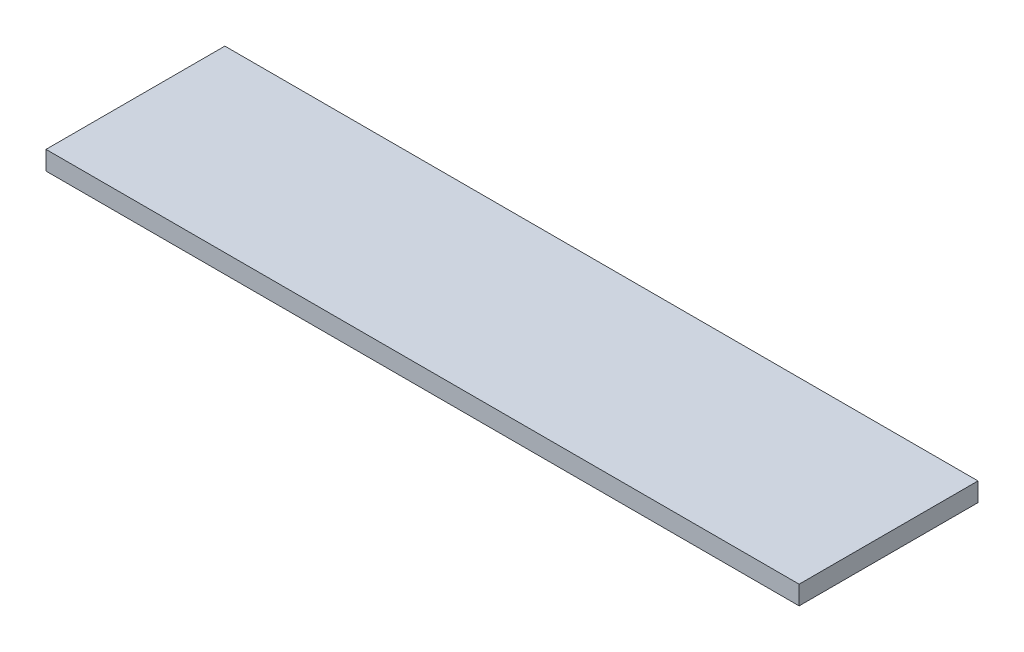
ISO-10303-21;
HEADER;
FILE_DESCRIPTION(('STEP AP214'),'2;1');
FILE_NAME('part.step','',(''),(''),'','','');
FILE_SCHEMA(('AUTOMOTIVE_DESIGN { 1 0 10303 214 1 1 1 1 }'));
ENDSEC;
DATA;
#1=APPLICATION_CONTEXT('core data for automotive mechanical design processes');
#2=APPLICATION_PROTOCOL_DEFINITION('international standard','automotive_design',2000,#1);
#3=PRODUCT_CONTEXT('',#1,'mechanical');
#4=PRODUCT('Part','Part','',(#3));
#5=PRODUCT_RELATED_PRODUCT_CATEGORY('part','',(#4));
#6=PRODUCT_DEFINITION_FORMATION('','',#4);
#7=PRODUCT_DEFINITION_CONTEXT('part definition',#1,'design');
#8=PRODUCT_DEFINITION('design','',#6,#7);
#9=PRODUCT_DEFINITION_SHAPE('','',#8);
#10=(LENGTH_UNIT() NAMED_UNIT(*) SI_UNIT(.MILLI.,.METRE.));
#11=(NAMED_UNIT(*) PLANE_ANGLE_UNIT() SI_UNIT($,.RADIAN.));
#12=(NAMED_UNIT(*) SI_UNIT($,.STERADIAN.) SOLID_ANGLE_UNIT());
#13=UNCERTAINTY_MEASURE_WITH_UNIT(LENGTH_MEASURE(1.E-05),#10,'distance_accuracy_value','');
#14=(GEOMETRIC_REPRESENTATION_CONTEXT(3) GLOBAL_UNCERTAINTY_ASSIGNED_CONTEXT((#13)) GLOBAL_UNIT_ASSIGNED_CONTEXT((#10,
#11,#12)) REPRESENTATION_CONTEXT('',''));
#15=CARTESIAN_POINT('',(0.,0.,0.));
#16=DIRECTION('',(0.,0.,1.));
#17=DIRECTION('',(1.,0.,0.));
#18=AXIS2_PLACEMENT_3D('',#15,#16,#17);
#19=CARTESIAN_POINT('',(200.,10.,-47.5));
#20=DIRECTION('',(-1.,0.,0.));
#21=DIRECTION('',(0.,0.,1.));
#22=AXIS2_PLACEMENT_3D('',#19,#20,#21);
#23=PLANE('',#22);
#24=DIRECTION('',(0.,0.,-1.));
#25=VECTOR('',#24,1.);
#26=CARTESIAN_POINT('',(200.,0.,-47.5));
#27=LINE('',#26,#25);
#28=CARTESIAN_POINT('',(200.,0.,47.5));
#29=VERTEX_POINT('',#28);
#30=CARTESIAN_POINT('',(200.,0.,-47.5));
#31=VERTEX_POINT('',#30);
#32=EDGE_CURVE('E100',#29,#31,#27,.T.);
#33=ORIENTED_EDGE('',*,*,#32,.T.);
#34=DIRECTION('',(0.,-1.,0.));
#35=VECTOR('',#34,1.);
#36=CARTESIAN_POINT('',(200.,10.,-47.5));
#37=LINE('',#36,#35);
#38=CARTESIAN_POINT('',(200.,10.,-47.5));
#39=VERTEX_POINT('',#38);
#40=EDGE_CURVE('E11',#39,#31,#37,.T.);
#41=ORIENTED_EDGE('',*,*,#40,.F.);
#42=DIRECTION('',(0.,0.,-1.));
#43=VECTOR('',#42,1.);
#44=CARTESIAN_POINT('',(200.,10.,-47.5));
#45=LINE('',#44,#43);
#46=CARTESIAN_POINT('',(200.,10.,47.5));
#47=VERTEX_POINT('',#46);
#48=EDGE_CURVE('E88',#47,#39,#45,.T.);
#49=ORIENTED_EDGE('',*,*,#48,.F.);
#50=DIRECTION('',(0.,-1.,0.));
#51=VECTOR('',#50,1.);
#52=CARTESIAN_POINT('',(200.,10.,47.5));
#53=LINE('',#52,#51);
#54=EDGE_CURVE('E96',#47,#29,#53,.T.);
#55=ORIENTED_EDGE('',*,*,#54,.T.);
#56=EDGE_LOOP('',(#33,#41,#49,#55));
#57=FACE_BOUND('',#56,.T.);
#58=ADVANCED_FACE('F37',(#57),#23,.F.);
#59=CARTESIAN_POINT('',(-200.,10.,-47.5));
#60=DIRECTION('',(0.,0.,1.));
#61=DIRECTION('',(1.,0.,0.));
#62=AXIS2_PLACEMENT_3D('',#59,#60,#61);
#63=PLANE('',#62);
#64=DIRECTION('',(-1.,0.,0.));
#65=VECTOR('',#64,1.);
#66=CARTESIAN_POINT('',(-200.,0.,-47.5));
#67=LINE('',#66,#65);
#68=CARTESIAN_POINT('',(-200.,0.,-47.5));
#69=VERTEX_POINT('',#68);
#70=EDGE_CURVE('E92',#31,#69,#67,.T.);
#71=ORIENTED_EDGE('',*,*,#70,.T.);
#72=DIRECTION('',(0.,-1.,0.));
#73=VECTOR('',#72,1.);
#74=CARTESIAN_POINT('',(-200.,10.,-47.5));
#75=LINE('',#74,#73);
#76=CARTESIAN_POINT('',(-200.,10.,-47.5));
#77=VERTEX_POINT('',#76);
#78=EDGE_CURVE('E45',#77,#69,#75,.T.);
#79=ORIENTED_EDGE('',*,*,#78,.F.);
#80=DIRECTION('',(-1.,0.,0.));
#81=VECTOR('',#80,1.);
#82=CARTESIAN_POINT('',(-200.,10.,-47.5));
#83=LINE('',#82,#81);
#84=EDGE_CURVE('E83',#39,#77,#83,.T.);
#85=ORIENTED_EDGE('',*,*,#84,.F.);
#86=ORIENTED_EDGE('',*,*,#40,.T.);
#87=EDGE_LOOP('',(#71,#79,#85,#86));
#88=FACE_BOUND('',#87,.T.);
#89=ADVANCED_FACE('F91',(#88),#63,.F.);
#90=CARTESIAN_POINT('',(-200.,10.,-47.5));
#91=DIRECTION('',(1.,0.,0.));
#92=DIRECTION('',(0.,0.,-1.));
#93=AXIS2_PLACEMENT_3D('',#90,#91,#92);
#94=PLANE('',#93);
#95=DIRECTION('',(0.,0.,1.));
#96=VECTOR('',#95,1.);
#97=CARTESIAN_POINT('',(-200.,0.,-47.5));
#98=LINE('',#97,#96);
#99=CARTESIAN_POINT('',(-200.,0.,47.5));
#100=VERTEX_POINT('',#99);
#101=EDGE_CURVE('E70',#69,#100,#98,.T.);
#102=ORIENTED_EDGE('',*,*,#101,.T.);
#103=DIRECTION('',(0.,-1.,0.));
#104=VECTOR('',#103,1.);
#105=CARTESIAN_POINT('',(-200.,10.,47.5));
#106=LINE('',#105,#104);
#107=CARTESIAN_POINT('',(-200.,10.,47.5));
#108=VERTEX_POINT('',#107);
#109=EDGE_CURVE('E93',#108,#100,#106,.T.);
#110=ORIENTED_EDGE('',*,*,#109,.F.);
#111=DIRECTION('',(0.,0.,1.));
#112=VECTOR('',#111,1.);
#113=CARTESIAN_POINT('',(-200.,10.,-47.5));
#114=LINE('',#113,#112);
#115=EDGE_CURVE('E86',#77,#108,#114,.T.);
#116=ORIENTED_EDGE('',*,*,#115,.F.);
#117=ORIENTED_EDGE('',*,*,#78,.T.);
#118=EDGE_LOOP('',(#102,#110,#116,#117));
#119=FACE_BOUND('',#118,.T.);
#120=ADVANCED_FACE('F94',(#119),#94,.F.);
#121=CARTESIAN_POINT('',(-200.,10.,47.5));
#122=DIRECTION('',(0.,0.,-1.));
#123=DIRECTION('',(-1.,0.,0.));
#124=AXIS2_PLACEMENT_3D('',#121,#122,#123);
#125=PLANE('',#124);
#126=DIRECTION('',(1.,0.,0.));
#127=VECTOR('',#126,1.);
#128=CARTESIAN_POINT('',(-200.,0.,47.5));
#129=LINE('',#128,#127);
#130=EDGE_CURVE('E76',#100,#29,#129,.T.);
#131=ORIENTED_EDGE('',*,*,#130,.T.);
#132=ORIENTED_EDGE('',*,*,#54,.F.);
#133=DIRECTION('',(1.,0.,0.));
#134=VECTOR('',#133,1.);
#135=CARTESIAN_POINT('',(-200.,10.,47.5));
#136=LINE('',#135,#134);
#137=EDGE_CURVE('E53',#108,#47,#136,.T.);
#138=ORIENTED_EDGE('',*,*,#137,.F.);
#139=ORIENTED_EDGE('',*,*,#109,.T.);
#140=EDGE_LOOP('',(#131,#132,#138,#139));
#141=FACE_BOUND('',#140,.T.);
#142=ADVANCED_FACE('F107',(#141),#125,.F.);
#143=CARTESIAN_POINT('',(0.,10.,0.));
#144=DIRECTION('',(0.,1.,0.));
#145=DIRECTION('',(0.,0.,1.));
#146=AXIS2_PLACEMENT_3D('',#143,#144,#145);
#147=PLANE('',#146);
#148=ORIENTED_EDGE('',*,*,#48,.T.);
#149=ORIENTED_EDGE('',*,*,#84,.T.);
#150=ORIENTED_EDGE('',*,*,#115,.T.);
#151=ORIENTED_EDGE('',*,*,#137,.T.);
#152=EDGE_LOOP('',(#148,#149,#150,#151));
#153=FACE_BOUND('',#152,.T.);
#154=ADVANCED_FACE('F84',(#153),#147,.T.);
#155=CARTESIAN_POINT('',(0.,0.,0.));
#156=DIRECTION('',(0.,1.,0.));
#157=DIRECTION('',(0.,0.,1.));
#158=AXIS2_PLACEMENT_3D('',#155,#156,#157);
#159=PLANE('',#158);
#160=ORIENTED_EDGE('',*,*,#32,.F.);
#161=ORIENTED_EDGE('',*,*,#130,.F.);
#162=ORIENTED_EDGE('',*,*,#101,.F.);
#163=ORIENTED_EDGE('',*,*,#70,.F.);
#164=EDGE_LOOP('',(#160,#161,#162,#163));
#165=FACE_BOUND('',#164,.T.);
#166=ADVANCED_FACE('F110',(#165),#159,.F.);
#167=CLOSED_SHELL('',(#58,#89,#120,#142,#154,#166));
#168=MANIFOLD_SOLID_BREP('B2',#167);
#169=ADVANCED_BREP_SHAPE_REPRESENTATION('',(#18,#168),#14);
#170=SHAPE_DEFINITION_REPRESENTATION(#9,#169);
ENDSEC;
END-ISO-10303-21;
